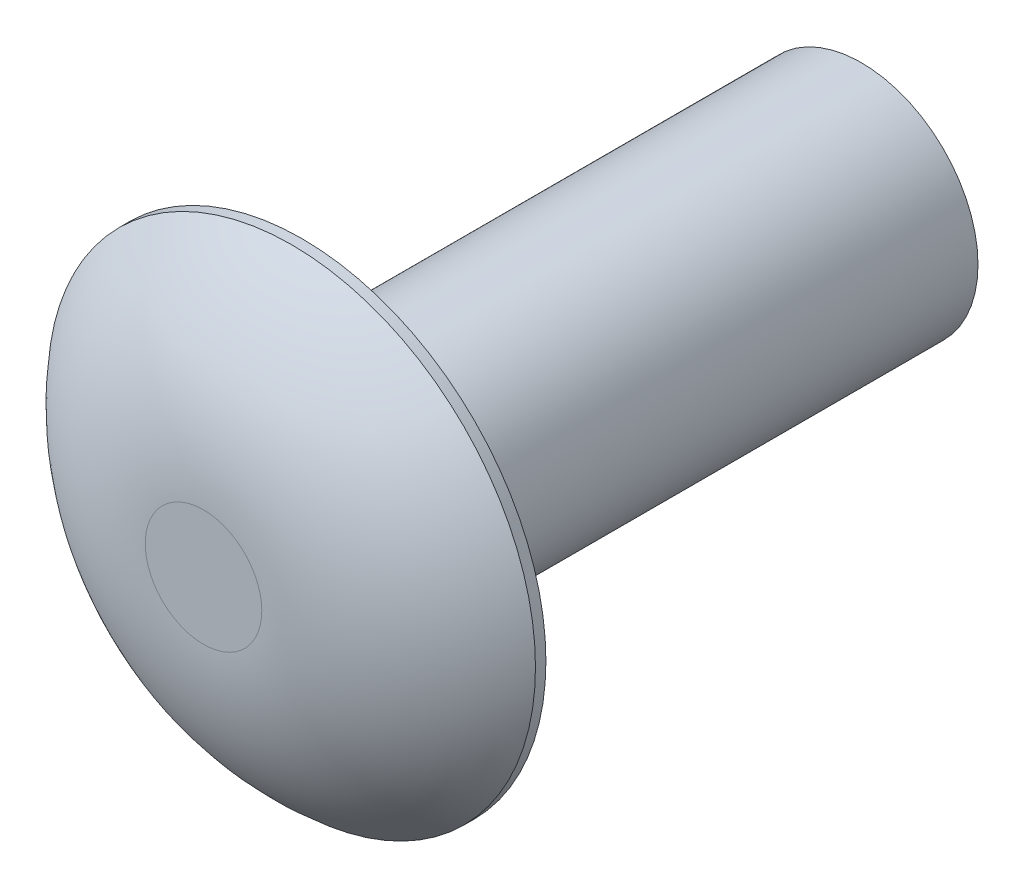
ISO-10303-21;
HEADER;
FILE_DESCRIPTION(('STEP AP214'),'2;1');
FILE_NAME('part.step','',(''),(''),'','','');
FILE_SCHEMA(('AUTOMOTIVE_DESIGN { 1 0 10303 214 1 1 1 1 }'));
ENDSEC;
DATA;
#1=APPLICATION_CONTEXT('core data for automotive mechanical design processes');
#2=APPLICATION_PROTOCOL_DEFINITION('international standard','automotive_design',2000,#1);
#3=PRODUCT_CONTEXT('',#1,'mechanical');
#4=PRODUCT('Part','Part','',(#3));
#5=PRODUCT_RELATED_PRODUCT_CATEGORY('part','',(#4));
#6=PRODUCT_DEFINITION_FORMATION('','',#4);
#7=PRODUCT_DEFINITION_CONTEXT('part definition',#1,'design');
#8=PRODUCT_DEFINITION('design','',#6,#7);
#9=PRODUCT_DEFINITION_SHAPE('','',#8);
#10=(LENGTH_UNIT() NAMED_UNIT(*) SI_UNIT(.MILLI.,.METRE.));
#11=(NAMED_UNIT(*) PLANE_ANGLE_UNIT() SI_UNIT($,.RADIAN.));
#12=(NAMED_UNIT(*) SI_UNIT($,.STERADIAN.) SOLID_ANGLE_UNIT());
#13=UNCERTAINTY_MEASURE_WITH_UNIT(LENGTH_MEASURE(1.E-05),#10,'distance_accuracy_value','');
#14=(GEOMETRIC_REPRESENTATION_CONTEXT(3) GLOBAL_UNCERTAINTY_ASSIGNED_CONTEXT((#13)) GLOBAL_UNIT_ASSIGNED_CONTEXT((#10,
#11,#12)) REPRESENTATION_CONTEXT('',''));
#15=CARTESIAN_POINT('',(0.,0.,0.));
#16=DIRECTION('',(0.,0.,1.));
#17=DIRECTION('',(1.,0.,0.));
#18=AXIS2_PLACEMENT_3D('',#15,#16,#17);
#19=CARTESIAN_POINT('',(0.,1.87088669188941,-9.525));
#20=DIRECTION('',(0.,0.,1.));
#21=DIRECTION('',(1.,0.,0.));
#22=AXIS2_PLACEMENT_3D('',#19,#20,#21);
#23=PLANE('',#22);
#24=CARTESIAN_POINT('',(0.,0.,-9.525));
#25=DIRECTION('',(0.,0.,1.));
#26=DIRECTION('',(1.,0.,0.));
#27=AXIS2_PLACEMENT_3D('',#24,#25,#26);
#28=CIRCLE('',#27,1.984375);
#29=CARTESIAN_POINT('',(1.984375,0.,-9.525));
#30=VERTEX_POINT('',#29);
#31=EDGE_CURVE('E52',#30,#30,#28,.T.);
#32=ORIENTED_EDGE('',*,*,#31,.F.);
#33=EDGE_LOOP('',(#32));
#34=FACE_BOUND('',#33,.T.);
#35=ADVANCED_FACE('F39',(#34),#23,.F.);
#36=CARTESIAN_POINT('',(0.,0.,20.7264));
#37=DIRECTION('',(0.,0.,1.));
#38=DIRECTION('',(1.,0.,0.));
#39=AXIS2_PLACEMENT_3D('',#36,#37,#38);
#40=CYLINDRICAL_SURFACE('',#39,1.984375);
#41=CARTESIAN_POINT('',(0.,0.,-0.254000000000001));
#42=DIRECTION('',(0.,0.,1.));
#43=DIRECTION('',(1.,0.,0.));
#44=AXIS2_PLACEMENT_3D('',#41,#42,#43);
#45=CIRCLE('',#44,1.984375);
#46=CARTESIAN_POINT('',(1.984375,0.,-0.254000000000001));
#47=VERTEX_POINT('',#46);
#48=EDGE_CURVE('E10',#47,#47,#45,.F.);
#49=ORIENTED_EDGE('',*,*,#48,.T.);
#50=EDGE_LOOP('',(#49));
#51=FACE_BOUND('',#50,.T.);
#52=ORIENTED_EDGE('',*,*,#31,.T.);
#53=EDGE_LOOP('',(#52));
#54=FACE_BOUND('',#53,.T.);
#55=ADVANCED_FACE('F88',(#51,#54),#40,.T.);
#56=CARTESIAN_POINT('',(0.,1.984375,0.));
#57=DIRECTION('',(0.,0.,1.));
#58=DIRECTION('',(1.,0.,0.));
#59=AXIS2_PLACEMENT_3D('',#56,#57,#58);
#60=PLANE('',#59);
#61=CARTESIAN_POINT('',(0.,0.,0.));
#62=DIRECTION('',(0.,0.,1.));
#63=DIRECTION('',(1.,0.,0.));
#64=AXIS2_PLACEMENT_3D('',#61,#62,#63);
#65=CIRCLE('',#64,2.238375);
#66=CARTESIAN_POINT('',(2.238375,0.,0.));
#67=VERTEX_POINT('',#66);
#68=EDGE_CURVE('E47',#67,#67,#65,.T.);
#69=ORIENTED_EDGE('',*,*,#68,.T.);
#70=EDGE_LOOP('',(#69));
#71=FACE_BOUND('',#70,.T.);
#72=CARTESIAN_POINT('',(0.,0.,0.));
#73=DIRECTION('',(0.,0.,1.));
#74=DIRECTION('',(1.,0.,0.));
#75=AXIS2_PLACEMENT_3D('',#72,#73,#74);
#76=CIRCLE('',#75,4.1529);
#77=CARTESIAN_POINT('',(4.1529,0.,0.));
#78=VERTEX_POINT('',#77);
#79=EDGE_CURVE('E57',#78,#78,#76,.T.);
#80=ORIENTED_EDGE('',*,*,#79,.F.);
#81=EDGE_LOOP('',(#80));
#82=FACE_BOUND('',#81,.T.);
#83=ADVANCED_FACE('F83',(#71,#82),#60,.F.);
#84=CARTESIAN_POINT('',(0.,0.,20.7264));
#85=DIRECTION('',(0.,0.,1.));
#86=DIRECTION('',(1.,0.,0.));
#87=AXIS2_PLACEMENT_3D('',#84,#85,#86);
#88=CYLINDRICAL_SURFACE('',#87,4.1529);
#89=CARTESIAN_POINT('',(0.,0.,0.177799999999999));
#90=DIRECTION('',(0.,0.,1.));
#91=DIRECTION('',(1.,0.,0.));
#92=AXIS2_PLACEMENT_3D('',#89,#90,#91);
#93=CIRCLE('',#92,4.1529);
#94=CARTESIAN_POINT('',(4.1529,0.,0.177799999999999));
#95=VERTEX_POINT('',#94);
#96=EDGE_CURVE('E63',#95,#95,#93,.T.);
#97=ORIENTED_EDGE('',*,*,#96,.F.);
#98=EDGE_LOOP('',(#97));
#99=FACE_BOUND('',#98,.T.);
#100=ORIENTED_EDGE('',*,*,#79,.T.);
#101=EDGE_LOOP('',(#100));
#102=FACE_BOUND('',#101,.T.);
#103=ADVANCED_FACE('F77',(#99,#102),#88,.T.);
#104=CARTESIAN_POINT('',(0.,0.,-2.40604543829449));
#105=DIRECTION('',(0.,0.,1.));
#106=DIRECTION('',(1.,0.,0.));
#107=AXIS2_PLACEMENT_3D('',#104,#105,#106);
#108=DEGENERATE_TOROIDAL_SURFACE('',#107,0.9921875,4.08244543829449,.T.);
#109=CARTESIAN_POINT('',(0.,0.,1.6764));
#110=DIRECTION('',(0.,0.,1.));
#111=DIRECTION('',(1.,0.,0.));
#112=AXIS2_PLACEMENT_3D('',#109,#110,#111);
#113=CIRCLE('',#112,0.9921875);
#114=CARTESIAN_POINT('',(0.9921875,0.,1.6764));
#115=VERTEX_POINT('',#114);
#116=EDGE_CURVE('E67',#115,#115,#113,.T.);
#117=ORIENTED_EDGE('',*,*,#116,.F.);
#118=EDGE_LOOP('',(#117));
#119=FACE_BOUND('',#118,.T.);
#120=ORIENTED_EDGE('',*,*,#96,.T.);
#121=EDGE_LOOP('',(#120));
#122=FACE_BOUND('',#121,.T.);
#123=ADVANCED_FACE('F74',(#119,#122),#108,.T.);
#124=CARTESIAN_POINT('',(0.,0.,-0.254000000000001));
#125=DIRECTION('',(0.,0.,1.));
#126=DIRECTION('',(1.,0.,0.));
#127=AXIS2_PLACEMENT_3D('',#124,#125,#126);
#128=TOROIDAL_SURFACE('',#127,2.238375,0.254);
#129=ORIENTED_EDGE('',*,*,#48,.F.);
#130=EDGE_LOOP('',(#129));
#131=FACE_BOUND('',#130,.T.);
#132=ORIENTED_EDGE('',*,*,#68,.F.);
#133=EDGE_LOOP('',(#132));
#134=FACE_BOUND('',#133,.T.);
#135=ADVANCED_FACE('F41',(#131,#134),#128,.F.);
#136=CARTESIAN_POINT('',(-0.992187499999957,-4.1529,1.6764));
#137=DIRECTION('',(0.,0.,-1.));
#138=DIRECTION('',(-1.,0.,0.));
#139=AXIS2_PLACEMENT_3D('',#136,#137,#138);
#140=PLANE('',#139);
#141=ORIENTED_EDGE('',*,*,#116,.T.);
#142=EDGE_LOOP('',(#141));
#143=FACE_BOUND('',#142,.T.);
#144=ADVANCED_FACE('F72',(#143),#140,.F.);
#145=CLOSED_SHELL('',(#35,#55,#83,#103,#123,#135,#144));
#146=MANIFOLD_SOLID_BREP('B2',#145);
#147=ADVANCED_BREP_SHAPE_REPRESENTATION('',(#18,#146),#14);
#148=SHAPE_DEFINITION_REPRESENTATION(#9,#147);
ENDSEC;
END-ISO-10303-21;
